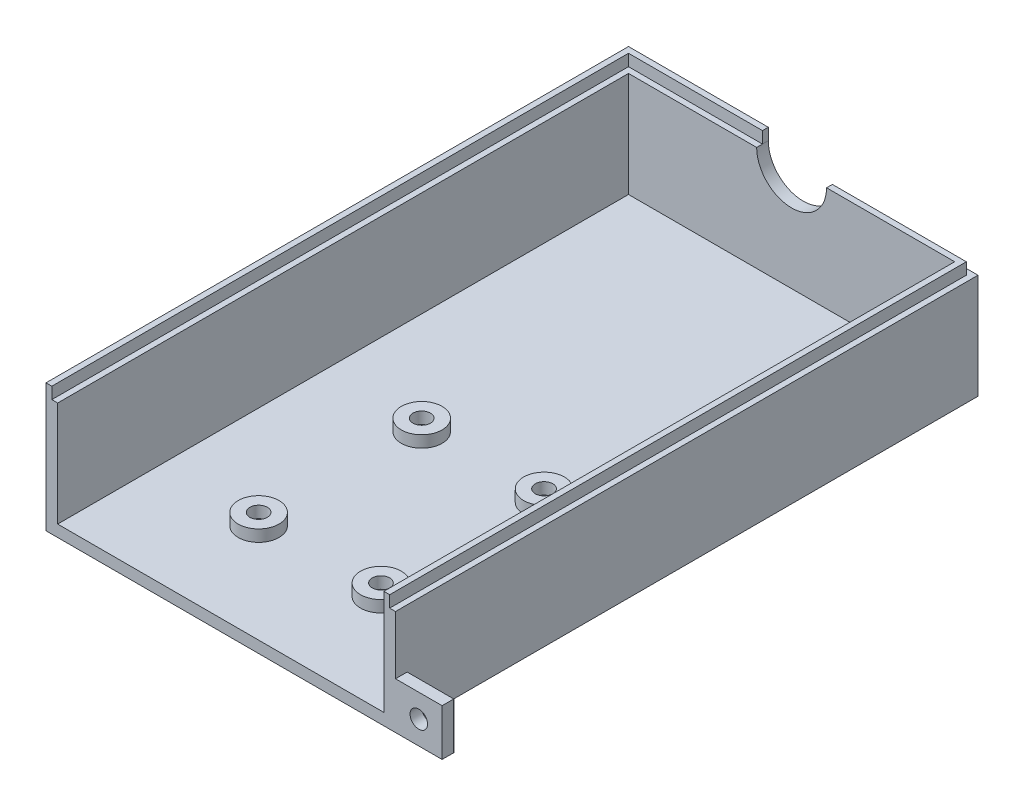
ISO-10303-21;
HEADER;
FILE_DESCRIPTION(('STEP AP214'),'2;1');
FILE_NAME('part.step','',(''),(''),'','','');
FILE_SCHEMA(('AUTOMOTIVE_DESIGN { 1 0 10303 214 1 1 1 1 }'));
ENDSEC;
DATA;
#1=APPLICATION_CONTEXT('core data for automotive mechanical design processes');
#2=APPLICATION_PROTOCOL_DEFINITION('international standard','automotive_design',2000,#1);
#3=PRODUCT_CONTEXT('',#1,'mechanical');
#4=PRODUCT('Part','Part','',(#3));
#5=PRODUCT_RELATED_PRODUCT_CATEGORY('part','',(#4));
#6=PRODUCT_DEFINITION_FORMATION('','',#4);
#7=PRODUCT_DEFINITION_CONTEXT('part definition',#1,'design');
#8=PRODUCT_DEFINITION('design','',#6,#7);
#9=PRODUCT_DEFINITION_SHAPE('','',#8);
#10=(LENGTH_UNIT() NAMED_UNIT(*) SI_UNIT(.MILLI.,.METRE.));
#11=(NAMED_UNIT(*) PLANE_ANGLE_UNIT() SI_UNIT($,.RADIAN.));
#12=(NAMED_UNIT(*) SI_UNIT($,.STERADIAN.) SOLID_ANGLE_UNIT());
#13=UNCERTAINTY_MEASURE_WITH_UNIT(LENGTH_MEASURE(1.E-05),#10,'distance_accuracy_value','');
#14=(GEOMETRIC_REPRESENTATION_CONTEXT(3) GLOBAL_UNCERTAINTY_ASSIGNED_CONTEXT((#13)) GLOBAL_UNIT_ASSIGNED_CONTEXT((#10,
#11,#12)) REPRESENTATION_CONTEXT('',''));
#15=CARTESIAN_POINT('',(0.,0.,0.));
#16=DIRECTION('',(0.,0.,1.));
#17=DIRECTION('',(1.,0.,0.));
#18=AXIS2_PLACEMENT_3D('',#15,#16,#17);
#19=CARTESIAN_POINT('',(60.,40.,0.));
#20=DIRECTION('',(-1.,0.,0.));
#21=DIRECTION('',(0.,0.,1.));
#22=AXIS2_PLACEMENT_3D('',#19,#20,#21);
#23=PLANE('',#22);
#24=DIRECTION('',(0.,0.,1.));
#25=VECTOR('',#24,1.);
#26=CARTESIAN_POINT('',(60.,8.,-2.));
#27=LINE('',#26,#25);
#28=CARTESIAN_POINT('',(60.,8.,-2.));
#29=VERTEX_POINT('',#28);
#30=CARTESIAN_POINT('',(60.,8.,0.));
#31=VERTEX_POINT('',#30);
#32=EDGE_CURVE('E203',#29,#31,#27,.T.);
#33=ORIENTED_EDGE('',*,*,#32,.F.);
#34=DIRECTION('',(0.,-1.,0.));
#35=VECTOR('',#34,1.);
#36=CARTESIAN_POINT('',(60.,0.,-2.));
#37=LINE('',#36,#35);
#38=CARTESIAN_POINT('',(60.,0.,-2.));
#39=VERTEX_POINT('',#38);
#40=EDGE_CURVE('E192',#29,#39,#37,.T.);
#41=ORIENTED_EDGE('',*,*,#40,.T.);
#42=DIRECTION('',(0.,0.,-1.));
#43=VECTOR('',#42,1.);
#44=CARTESIAN_POINT('',(60.,0.,0.));
#45=LINE('',#44,#43);
#46=CARTESIAN_POINT('',(60.,0.,-100.));
#47=VERTEX_POINT('',#46);
#48=EDGE_CURVE('E191',#39,#47,#45,.T.);
#49=ORIENTED_EDGE('',*,*,#48,.T.);
#50=DIRECTION('',(0.,-1.,0.));
#51=VECTOR('',#50,1.);
#52=CARTESIAN_POINT('',(60.,40.,-100.));
#53=LINE('',#52,#51);
#54=CARTESIAN_POINT('',(60.,18.,-100.));
#55=VERTEX_POINT('',#54);
#56=EDGE_CURVE('E349',#55,#47,#53,.T.);
#57=ORIENTED_EDGE('',*,*,#56,.F.);
#58=DIRECTION('',(0.,0.,-1.));
#59=VECTOR('',#58,1.);
#60=CARTESIAN_POINT('',(60.,18.,0.));
#61=LINE('',#60,#59);
#62=CARTESIAN_POINT('',(60.,18.,0.));
#63=VERTEX_POINT('',#62);
#64=EDGE_CURVE('E245',#63,#55,#61,.T.);
#65=ORIENTED_EDGE('',*,*,#64,.F.);
#66=DIRECTION('',(0.,-1.,0.));
#67=VECTOR('',#66,1.);
#68=CARTESIAN_POINT('',(60.,40.,0.));
#69=LINE('',#68,#67);
#70=EDGE_CURVE('E352',#63,#31,#69,.T.);
#71=ORIENTED_EDGE('',*,*,#70,.T.);
#72=EDGE_LOOP('',(#33,#41,#49,#57,#65,#71));
#73=FACE_BOUND('',#72,.T.);
#74=ADVANCED_FACE('F37',(#73),#23,.F.);
#75=CARTESIAN_POINT('',(0.,40.,-100.));
#76=DIRECTION('',(0.,0.,1.));
#77=DIRECTION('',(1.,0.,0.));
#78=AXIS2_PLACEMENT_3D('',#75,#76,#77);
#79=PLANE('',#78);
#80=DIRECTION('',(-1.,0.,0.));
#81=VECTOR('',#80,1.);
#82=CARTESIAN_POINT('',(0.,18.,-100.));
#83=LINE('',#82,#81);
#84=CARTESIAN_POINT('',(35.6568542494924,18.,-100.));
#85=VERTEX_POINT('',#84);
#86=EDGE_CURVE('E247',#55,#85,#83,.T.);
#87=ORIENTED_EDGE('',*,*,#86,.F.);
#88=ORIENTED_EDGE('',*,*,#56,.T.);
#89=DIRECTION('',(-1.,0.,0.));
#90=VECTOR('',#89,1.);
#91=CARTESIAN_POINT('',(0.,0.,-100.));
#92=LINE('',#91,#90);
#93=CARTESIAN_POINT('',(0.,0.,-100.));
#94=VERTEX_POINT('',#93);
#95=EDGE_CURVE('E344',#47,#94,#92,.T.);
#96=ORIENTED_EDGE('',*,*,#95,.T.);
#97=DIRECTION('',(0.,-1.,0.));
#98=VECTOR('',#97,1.);
#99=CARTESIAN_POINT('',(0.,40.,-100.));
#100=LINE('',#99,#98);
#101=CARTESIAN_POINT('',(0.,22.,-100.));
#102=VERTEX_POINT('',#101);
#103=EDGE_CURVE('E347',#102,#94,#100,.T.);
#104=ORIENTED_EDGE('',*,*,#103,.F.);
#105=DIRECTION('',(1.,0.,0.));
#106=VECTOR('',#105,1.);
#107=CARTESIAN_POINT('',(0.,22.,-100.));
#108=LINE('',#107,#106);
#109=CARTESIAN_POINT('',(24.,22.,-100.));
#110=VERTEX_POINT('',#109);
#111=EDGE_CURVE('E210',#102,#110,#108,.T.);
#112=ORIENTED_EDGE('',*,*,#111,.T.);
#113=DIRECTION('',(0.,-1.,0.));
#114=VECTOR('',#113,1.);
#115=CARTESIAN_POINT('',(24.,22.,-100.));
#116=LINE('',#115,#114);
#117=CARTESIAN_POINT('',(24.,20.,-100.));
#118=VERTEX_POINT('',#117);
#119=EDGE_CURVE('E234',#110,#118,#116,.T.);
#120=ORIENTED_EDGE('',*,*,#119,.T.);
#121=CARTESIAN_POINT('',(30.,20.,-100.));
#122=DIRECTION('',(0.,0.,1.));
#123=DIRECTION('',(1.,0.,0.));
#124=AXIS2_PLACEMENT_3D('',#121,#122,#123);
#125=CIRCLE('',#124,6.);
#126=EDGE_CURVE('E266',#85,#118,#125,.F.);
#127=ORIENTED_EDGE('',*,*,#126,.F.);
#128=EDGE_LOOP('',(#87,#88,#96,#104,#112,#120,#127));
#129=FACE_BOUND('',#128,.T.);
#130=ADVANCED_FACE('F416',(#129),#79,.F.);
#131=CARTESIAN_POINT('',(0.,20.,0.));
#132=DIRECTION('',(0.,-1.,0.));
#133=DIRECTION('',(0.,0.,-1.));
#134=AXIS2_PLACEMENT_3D('',#131,#132,#133);
#135=PLANE('',#134);
#136=DIRECTION('',(0.,0.,1.));
#137=VECTOR('',#136,1.);
#138=CARTESIAN_POINT('',(59.,20.,0.));
#139=LINE('',#138,#137);
#140=CARTESIAN_POINT('',(59.,20.,-99.));
#141=VERTEX_POINT('',#140);
#142=CARTESIAN_POINT('',(59.,20.,0.));
#143=VERTEX_POINT('',#142);
#144=EDGE_CURVE('E240',#141,#143,#139,.T.);
#145=ORIENTED_EDGE('',*,*,#144,.F.);
#146=DIRECTION('',(1.,0.,0.));
#147=VECTOR('',#146,1.);
#148=CARTESIAN_POINT('',(0.,20.,-99.));
#149=LINE('',#148,#147);
#150=CARTESIAN_POINT('',(36.,20.,-99.));
#151=VERTEX_POINT('',#150);
#152=EDGE_CURVE('E236',#151,#141,#149,.T.);
#153=ORIENTED_EDGE('',*,*,#152,.F.);
#154=DIRECTION('',(0.,0.,1.));
#155=VECTOR('',#154,1.);
#156=CARTESIAN_POINT('',(36.,20.,-100.001));
#157=LINE('',#156,#155);
#158=CARTESIAN_POINT('',(36.,20.,-98.));
#159=VERTEX_POINT('',#158);
#160=EDGE_CURVE('E261',#159,#151,#157,.F.);
#161=ORIENTED_EDGE('',*,*,#160,.F.);
#162=DIRECTION('',(-1.,0.,0.));
#163=VECTOR('',#162,1.);
#164=CARTESIAN_POINT('',(0.,20.,-98.));
#165=LINE('',#164,#163);
#166=CARTESIAN_POINT('',(58.,20.,-98.));
#167=VERTEX_POINT('',#166);
#168=EDGE_CURVE('E273',#167,#159,#165,.T.);
#169=ORIENTED_EDGE('',*,*,#168,.F.);
#170=DIRECTION('',(0.,0.,-1.));
#171=VECTOR('',#170,1.);
#172=CARTESIAN_POINT('',(58.,20.,0.));
#173=LINE('',#172,#171);
#174=CARTESIAN_POINT('',(58.,20.,0.));
#175=VERTEX_POINT('',#174);
#176=EDGE_CURVE('E276',#175,#167,#173,.T.);
#177=ORIENTED_EDGE('',*,*,#176,.F.);
#178=DIRECTION('',(1.,0.,0.));
#179=VECTOR('',#178,1.);
#180=CARTESIAN_POINT('',(0.,20.,0.));
#181=LINE('',#180,#179);
#182=EDGE_CURVE('E269',#175,#143,#181,.T.);
#183=ORIENTED_EDGE('',*,*,#182,.T.);
#184=EDGE_LOOP('',(#145,#153,#161,#169,#177,#183));
#185=FACE_BOUND('',#184,.T.);
#186=ADVANCED_FACE('F385',(#185),#135,.F.);
#187=CARTESIAN_POINT('',(0.,40.,0.));
#188=DIRECTION('',(0.,0.,-1.));
#189=DIRECTION('',(-1.,0.,0.));
#190=AXIS2_PLACEMENT_3D('',#187,#188,#189);
#191=PLANE('',#190);
#192=DIRECTION('',(1.,0.,0.));
#193=VECTOR('',#192,1.);
#194=CARTESIAN_POINT('',(0.,18.,0.));
#195=LINE('',#194,#193);
#196=CARTESIAN_POINT('',(59.,18.,0.));
#197=VERTEX_POINT('',#196);
#198=EDGE_CURVE('E243',#197,#63,#195,.T.);
#199=ORIENTED_EDGE('',*,*,#198,.F.);
#200=DIRECTION('',(0.,1.,0.));
#201=VECTOR('',#200,1.);
#202=CARTESIAN_POINT('',(59.,18.,0.));
#203=LINE('',#202,#201);
#204=EDGE_CURVE('E252',#197,#143,#203,.T.);
#205=ORIENTED_EDGE('',*,*,#204,.T.);
#206=ORIENTED_EDGE('',*,*,#182,.F.);
#207=DIRECTION('',(0.,-1.,0.));
#208=VECTOR('',#207,1.);
#209=CARTESIAN_POINT('',(58.,40.,0.));
#210=LINE('',#209,#208);
#211=CARTESIAN_POINT('',(58.,2.,0.));
#212=VERTEX_POINT('',#211);
#213=EDGE_CURVE('E330',#175,#212,#210,.T.);
#214=ORIENTED_EDGE('',*,*,#213,.T.);
#215=DIRECTION('',(1.,0.,0.));
#216=VECTOR('',#215,1.);
#217=CARTESIAN_POINT('',(0.,2.,0.));
#218=LINE('',#217,#216);
#219=CARTESIAN_POINT('',(2.,2.,0.));
#220=VERTEX_POINT('',#219);
#221=EDGE_CURVE('E321',#220,#212,#218,.T.);
#222=ORIENTED_EDGE('',*,*,#221,.F.);
#223=DIRECTION('',(0.,-1.,0.));
#224=VECTOR('',#223,1.);
#225=CARTESIAN_POINT('',(2.,40.,0.));
#226=LINE('',#225,#224);
#227=CARTESIAN_POINT('',(2.,20.,0.));
#228=VERTEX_POINT('',#227);
#229=EDGE_CURVE('E333',#228,#220,#226,.T.);
#230=ORIENTED_EDGE('',*,*,#229,.F.);
#231=CARTESIAN_POINT('',(0.999999999999987,20.,0.));
#232=VERTEX_POINT('',#231);
#233=EDGE_CURVE('E270',#232,#228,#181,.T.);
#234=ORIENTED_EDGE('',*,*,#233,.F.);
#235=DIRECTION('',(0.,-1.,0.));
#236=VECTOR('',#235,1.);
#237=CARTESIAN_POINT('',(0.999999999999987,22.,0.));
#238=LINE('',#237,#236);
#239=CARTESIAN_POINT('',(0.999999999999987,22.,0.));
#240=VERTEX_POINT('',#239);
#241=EDGE_CURVE('E232',#240,#232,#238,.T.);
#242=ORIENTED_EDGE('',*,*,#241,.F.);
#243=DIRECTION('',(-1.,0.,0.));
#244=VECTOR('',#243,1.);
#245=CARTESIAN_POINT('',(0.,22.,0.));
#246=LINE('',#245,#244);
#247=CARTESIAN_POINT('',(0.,22.,0.));
#248=VERTEX_POINT('',#247);
#249=EDGE_CURVE('E216',#240,#248,#246,.T.);
#250=ORIENTED_EDGE('',*,*,#249,.T.);
#251=DIRECTION('',(0.,-1.,0.));
#252=VECTOR('',#251,1.);
#253=CARTESIAN_POINT('',(0.,40.,0.));
#254=LINE('',#253,#252);
#255=CARTESIAN_POINT('',(0.,0.,0.));
#256=VERTEX_POINT('',#255);
#257=EDGE_CURVE('E355',#248,#256,#254,.T.);
#258=ORIENTED_EDGE('',*,*,#257,.T.);
#259=DIRECTION('',(1.,0.,0.));
#260=VECTOR('',#259,1.);
#261=CARTESIAN_POINT('',(0.,0.,0.));
#262=LINE('',#261,#260);
#263=CARTESIAN_POINT('',(68.,0.,0.));
#264=VERTEX_POINT('',#263);
#265=EDGE_CURVE('E341',#256,#264,#262,.T.);
#266=ORIENTED_EDGE('',*,*,#265,.T.);
#267=DIRECTION('',(0.,1.,0.));
#268=VECTOR('',#267,1.);
#269=CARTESIAN_POINT('',(68.,0.,0.));
#270=LINE('',#269,#268);
#271=CARTESIAN_POINT('',(68.,8.,0.));
#272=VERTEX_POINT('',#271);
#273=EDGE_CURVE('E178',#264,#272,#270,.T.);
#274=ORIENTED_EDGE('',*,*,#273,.T.);
#275=DIRECTION('',(-1.,0.,0.));
#276=VECTOR('',#275,1.);
#277=CARTESIAN_POINT('',(60.,8.,0.));
#278=LINE('',#277,#276);
#279=EDGE_CURVE('E194',#272,#31,#278,.T.);
#280=ORIENTED_EDGE('',*,*,#279,.T.);
#281=ORIENTED_EDGE('',*,*,#70,.F.);
#282=EDGE_LOOP('',(#199,#205,#206,#214,#222,#230,#234,#242,#250,#258,#266,#274,#280,#281));
#283=FACE_BOUND('',#282,.T.);
#284=CARTESIAN_POINT('',(64.,4.,0.));
#285=DIRECTION('',(0.,0.,1.));
#286=DIRECTION('',(1.,0.,0.));
#287=AXIS2_PLACEMENT_3D('',#284,#285,#286);
#288=CIRCLE('',#287,1.5);
#289=CARTESIAN_POINT('',(65.5,4.,0.));
#290=VERTEX_POINT('',#289);
#291=EDGE_CURVE('E792',#290,#290,#288,.T.);
#292=ORIENTED_EDGE('',*,*,#291,.F.);
#293=EDGE_LOOP('',(#292));
#294=FACE_BOUND('',#293,.T.);
#295=ADVANCED_FACE('F402',(#283,#294),#191,.F.);
#296=CARTESIAN_POINT('',(0.,40.,0.));
#297=DIRECTION('',(1.,0.,0.));
#298=DIRECTION('',(0.,0.,-1.));
#299=AXIS2_PLACEMENT_3D('',#296,#297,#298);
#300=PLANE('',#299);
#301=ORIENTED_EDGE('',*,*,#257,.F.);
#302=DIRECTION('',(0.,0.,-1.));
#303=VECTOR('',#302,1.);
#304=CARTESIAN_POINT('',(0.,22.,0.));
#305=LINE('',#304,#303);
#306=EDGE_CURVE('E213',#248,#102,#305,.T.);
#307=ORIENTED_EDGE('',*,*,#306,.T.);
#308=ORIENTED_EDGE('',*,*,#103,.T.);
#309=DIRECTION('',(0.,0.,1.));
#310=VECTOR('',#309,1.);
#311=CARTESIAN_POINT('',(0.,0.,0.));
#312=LINE('',#311,#310);
#313=EDGE_CURVE('E335',#94,#256,#312,.T.);
#314=ORIENTED_EDGE('',*,*,#313,.T.);
#315=EDGE_LOOP('',(#301,#307,#308,#314));
#316=FACE_BOUND('',#315,.T.);
#317=ADVANCED_FACE('F39',(#316),#300,.F.);
#318=CARTESIAN_POINT('',(0.,0.,0.));
#319=DIRECTION('',(0.,-1.,0.));
#320=DIRECTION('',(0.,0.,-1.));
#321=AXIS2_PLACEMENT_3D('',#318,#319,#320);
#322=PLANE('',#321);
#323=ORIENTED_EDGE('',*,*,#313,.F.);
#324=ORIENTED_EDGE('',*,*,#95,.F.);
#325=ORIENTED_EDGE('',*,*,#48,.F.);
#326=DIRECTION('',(1.,0.,0.));
#327=VECTOR('',#326,1.);
#328=CARTESIAN_POINT('',(60.,0.,-2.));
#329=LINE('',#328,#327);
#330=CARTESIAN_POINT('',(68.,0.,-2.));
#331=VERTEX_POINT('',#330);
#332=EDGE_CURVE('E52',#39,#331,#329,.T.);
#333=ORIENTED_EDGE('',*,*,#332,.T.);
#334=DIRECTION('',(0.,0.,1.));
#335=VECTOR('',#334,1.);
#336=CARTESIAN_POINT('',(68.,0.,-2.));
#337=LINE('',#336,#335);
#338=EDGE_CURVE('E173',#331,#264,#337,.T.);
#339=ORIENTED_EDGE('',*,*,#338,.T.);
#340=ORIENTED_EDGE('',*,*,#265,.F.);
#341=EDGE_LOOP('',(#323,#324,#325,#333,#339,#340));
#342=FACE_BOUND('',#341,.T.);
#343=ADVANCED_FACE('F189',(#342),#322,.T.);
#344=CARTESIAN_POINT('',(2.,40.,0.));
#345=DIRECTION('',(1.,0.,0.));
#346=DIRECTION('',(0.,0.,-1.));
#347=AXIS2_PLACEMENT_3D('',#344,#345,#346);
#348=PLANE('',#347);
#349=DIRECTION('',(0.,0.,1.));
#350=VECTOR('',#349,1.);
#351=CARTESIAN_POINT('',(2.,20.,0.));
#352=LINE('',#351,#350);
#353=CARTESIAN_POINT('',(2.,20.,-98.));
#354=VERTEX_POINT('',#353);
#355=EDGE_CURVE('E279',#354,#228,#352,.T.);
#356=ORIENTED_EDGE('',*,*,#355,.T.);
#357=ORIENTED_EDGE('',*,*,#229,.T.);
#358=DIRECTION('',(0.,0.,1.));
#359=VECTOR('',#358,1.);
#360=CARTESIAN_POINT('',(2.,2.,0.));
#361=LINE('',#360,#359);
#362=CARTESIAN_POINT('',(2.,2.,-98.));
#363=VERTEX_POINT('',#362);
#364=EDGE_CURVE('E316',#363,#220,#361,.T.);
#365=ORIENTED_EDGE('',*,*,#364,.F.);
#366=DIRECTION('',(0.,-1.,0.));
#367=VECTOR('',#366,1.);
#368=CARTESIAN_POINT('',(2.,40.,-98.));
#369=LINE('',#368,#367);
#370=EDGE_CURVE('E322',#354,#363,#369,.T.);
#371=ORIENTED_EDGE('',*,*,#370,.F.);
#372=EDGE_LOOP('',(#356,#357,#365,#371));
#373=FACE_BOUND('',#372,.T.);
#374=ADVANCED_FACE('F428',(#373),#348,.T.);
#375=CARTESIAN_POINT('',(58.,40.,0.));
#376=DIRECTION('',(-1.,0.,0.));
#377=DIRECTION('',(0.,0.,1.));
#378=AXIS2_PLACEMENT_3D('',#375,#376,#377);
#379=PLANE('',#378);
#380=ORIENTED_EDGE('',*,*,#176,.T.);
#381=DIRECTION('',(0.,-1.,0.));
#382=VECTOR('',#381,1.);
#383=CARTESIAN_POINT('',(58.,40.,-98.));
#384=LINE('',#383,#382);
#385=CARTESIAN_POINT('',(58.,2.,-98.));
#386=VERTEX_POINT('',#385);
#387=EDGE_CURVE('E324',#167,#386,#384,.T.);
#388=ORIENTED_EDGE('',*,*,#387,.T.);
#389=DIRECTION('',(0.,0.,-1.));
#390=VECTOR('',#389,1.);
#391=CARTESIAN_POINT('',(58.,2.,0.));
#392=LINE('',#391,#390);
#393=EDGE_CURVE('E328',#212,#386,#392,.T.);
#394=ORIENTED_EDGE('',*,*,#393,.F.);
#395=ORIENTED_EDGE('',*,*,#213,.F.);
#396=EDGE_LOOP('',(#380,#388,#394,#395));
#397=FACE_BOUND('',#396,.T.);
#398=ADVANCED_FACE('F393',(#397),#379,.T.);
#399=CARTESIAN_POINT('',(0.,40.,-98.));
#400=DIRECTION('',(0.,0.,1.));
#401=DIRECTION('',(1.,0.,0.));
#402=AXIS2_PLACEMENT_3D('',#399,#400,#401);
#403=PLANE('',#402);
#404=CARTESIAN_POINT('',(30.,20.,-98.));
#405=DIRECTION('',(0.,0.,1.));
#406=DIRECTION('',(1.,0.,0.));
#407=AXIS2_PLACEMENT_3D('',#404,#405,#406);
#408=CIRCLE('',#407,6.);
#409=CARTESIAN_POINT('',(24.,20.,-98.));
#410=VERTEX_POINT('',#409);
#411=EDGE_CURVE('E264',#410,#159,#408,.T.);
#412=ORIENTED_EDGE('',*,*,#411,.F.);
#413=EDGE_CURVE('E272',#410,#354,#165,.T.);
#414=ORIENTED_EDGE('',*,*,#413,.T.);
#415=ORIENTED_EDGE('',*,*,#370,.T.);
#416=DIRECTION('',(-1.,0.,0.));
#417=VECTOR('',#416,1.);
#418=CARTESIAN_POINT('',(0.,2.,-98.));
#419=LINE('',#418,#417);
#420=EDGE_CURVE('E325',#386,#363,#419,.T.);
#421=ORIENTED_EDGE('',*,*,#420,.F.);
#422=ORIENTED_EDGE('',*,*,#387,.F.);
#423=ORIENTED_EDGE('',*,*,#168,.T.);
#424=EDGE_LOOP('',(#412,#414,#415,#421,#422,#423));
#425=FACE_BOUND('',#424,.T.);
#426=ADVANCED_FACE('F388',(#425),#403,.T.);
#427=CARTESIAN_POINT('',(0.,2.,0.));
#428=DIRECTION('',(0.,-1.,0.));
#429=DIRECTION('',(0.,0.,-1.));
#430=AXIS2_PLACEMENT_3D('',#427,#428,#429);
#431=PLANE('',#430);
#432=CARTESIAN_POINT('',(19.5,2.,-45.));
#433=DIRECTION('',(0.,-1.,0.));
#434=DIRECTION('',(0.,0.,-1.));
#435=AXIS2_PLACEMENT_3D('',#432,#433,#434);
#436=CIRCLE('',#435,3.5);
#437=CARTESIAN_POINT('',(19.5,2.,-48.5));
#438=VERTEX_POINT('',#437);
#439=EDGE_CURVE('E366',#438,#438,#436,.F.);
#440=ORIENTED_EDGE('',*,*,#439,.F.);
#441=EDGE_LOOP('',(#440));
#442=FACE_BOUND('',#441,.T.);
#443=CARTESIAN_POINT('',(40.5,2.,-45.));
#444=DIRECTION('',(0.,-1.,0.));
#445=DIRECTION('',(0.,0.,-1.));
#446=AXIS2_PLACEMENT_3D('',#443,#444,#445);
#447=CIRCLE('',#446,3.5);
#448=CARTESIAN_POINT('',(40.5,2.,-48.5));
#449=VERTEX_POINT('',#448);
#450=EDGE_CURVE('E363',#449,#449,#447,.F.);
#451=ORIENTED_EDGE('',*,*,#450,.F.);
#452=EDGE_LOOP('',(#451));
#453=FACE_BOUND('',#452,.T.);
#454=CARTESIAN_POINT('',(40.5,2.,-17.));
#455=DIRECTION('',(0.,-1.,0.));
#456=DIRECTION('',(0.,0.,-1.));
#457=AXIS2_PLACEMENT_3D('',#454,#455,#456);
#458=CIRCLE('',#457,3.5);
#459=CARTESIAN_POINT('',(40.5,2.,-20.5));
#460=VERTEX_POINT('',#459);
#461=EDGE_CURVE('E360',#460,#460,#458,.F.);
#462=ORIENTED_EDGE('',*,*,#461,.F.);
#463=EDGE_LOOP('',(#462));
#464=FACE_BOUND('',#463,.T.);
#465=CARTESIAN_POINT('',(19.5,2.,-17.));
#466=DIRECTION('',(0.,-1.,0.));
#467=DIRECTION('',(0.,0.,-1.));
#468=AXIS2_PLACEMENT_3D('',#465,#466,#467);
#469=CIRCLE('',#468,3.5);
#470=CARTESIAN_POINT('',(19.5,2.,-20.5));
#471=VERTEX_POINT('',#470);
#472=EDGE_CURVE('E357',#471,#471,#469,.F.);
#473=ORIENTED_EDGE('',*,*,#472,.F.);
#474=EDGE_LOOP('',(#473));
#475=FACE_BOUND('',#474,.T.);
#476=ORIENTED_EDGE('',*,*,#364,.T.);
#477=ORIENTED_EDGE('',*,*,#221,.T.);
#478=ORIENTED_EDGE('',*,*,#393,.T.);
#479=ORIENTED_EDGE('',*,*,#420,.T.);
#480=EDGE_LOOP('',(#476,#477,#478,#479));
#481=FACE_BOUND('',#480,.T.);
#482=ADVANCED_FACE('F396',(#442,#453,#464,#475,#481),#431,.F.);
#483=CARTESIAN_POINT('',(19.5,4.,-17.));
#484=DIRECTION('',(0.,-1.,0.));
#485=DIRECTION('',(0.,0.,-1.));
#486=AXIS2_PLACEMENT_3D('',#483,#484,#485);
#487=CYLINDRICAL_SURFACE('',#486,1.5);
#488=CARTESIAN_POINT('',(19.5,4.,-17.));
#489=DIRECTION('',(0.,1.,0.));
#490=DIRECTION('',(0.,0.,1.));
#491=AXIS2_PLACEMENT_3D('',#488,#489,#490);
#492=CIRCLE('',#491,1.5);
#493=CARTESIAN_POINT('',(19.5,4.,-15.5));
#494=VERTEX_POINT('',#493);
#495=EDGE_CURVE('E310',#494,#494,#492,.T.);
#496=ORIENTED_EDGE('',*,*,#495,.T.);
#497=EDGE_LOOP('',(#496));
#498=FACE_BOUND('',#497,.T.);
#499=CARTESIAN_POINT('',(19.5,2.,-17.));
#500=DIRECTION('',(0.,1.,0.));
#501=DIRECTION('',(0.,0.,1.));
#502=AXIS2_PLACEMENT_3D('',#499,#500,#501);
#503=CIRCLE('',#502,1.5);
#504=CARTESIAN_POINT('',(19.5,2.,-15.5));
#505=VERTEX_POINT('',#504);
#506=EDGE_CURVE('E307',#505,#505,#503,.T.);
#507=ORIENTED_EDGE('',*,*,#506,.F.);
#508=EDGE_LOOP('',(#507));
#509=FACE_BOUND('',#508,.T.);
#510=ADVANCED_FACE('F477',(#498,#509),#487,.F.);
#511=CARTESIAN_POINT('',(19.5,4.,-17.));
#512=DIRECTION('',(0.,-1.,0.));
#513=DIRECTION('',(0.,0.,-1.));
#514=AXIS2_PLACEMENT_3D('',#511,#512,#513);
#515=CYLINDRICAL_SURFACE('',#514,3.5);
#516=CARTESIAN_POINT('',(19.5,4.,-17.));
#517=DIRECTION('',(0.,1.,0.));
#518=DIRECTION('',(0.,0.,1.));
#519=AXIS2_PLACEMENT_3D('',#516,#517,#518);
#520=CIRCLE('',#519,3.5);
#521=CARTESIAN_POINT('',(19.5,4.,-13.5));
#522=VERTEX_POINT('',#521);
#523=EDGE_CURVE('E313',#522,#522,#520,.T.);
#524=ORIENTED_EDGE('',*,*,#523,.F.);
#525=EDGE_LOOP('',(#524));
#526=FACE_BOUND('',#525,.T.);
#527=ORIENTED_EDGE('',*,*,#472,.T.);
#528=EDGE_LOOP('',(#527));
#529=FACE_BOUND('',#528,.T.);
#530=ADVANCED_FACE('F484',(#526,#529),#515,.T.);
#531=CARTESIAN_POINT('',(0.,4.,0.));
#532=DIRECTION('',(0.,1.,0.));
#533=DIRECTION('',(0.,0.,1.));
#534=AXIS2_PLACEMENT_3D('',#531,#532,#533);
#535=PLANE('',#534);
#536=ORIENTED_EDGE('',*,*,#495,.F.);
#537=EDGE_LOOP('',(#536));
#538=FACE_BOUND('',#537,.T.);
#539=ORIENTED_EDGE('',*,*,#523,.T.);
#540=EDGE_LOOP('',(#539));
#541=FACE_BOUND('',#540,.T.);
#542=ADVANCED_FACE('F490',(#538,#541),#535,.T.);
#543=ORIENTED_EDGE('',*,*,#506,.T.);
#544=EDGE_LOOP('',(#543));
#545=FACE_BOUND('',#544,.T.);
#546=ADVANCED_FACE('F479',(#545),#431,.F.);
#547=CARTESIAN_POINT('',(40.5,4.,-17.));
#548=DIRECTION('',(0.,-1.,0.));
#549=DIRECTION('',(0.,0.,-1.));
#550=AXIS2_PLACEMENT_3D('',#547,#548,#549);
#551=CYLINDRICAL_SURFACE('',#550,1.5);
#552=CARTESIAN_POINT('',(40.5,4.,-17.));
#553=DIRECTION('',(0.,1.,0.));
#554=DIRECTION('',(0.,0.,1.));
#555=AXIS2_PLACEMENT_3D('',#552,#553,#554);
#556=CIRCLE('',#555,1.5);
#557=CARTESIAN_POINT('',(40.5,4.,-15.5));
#558=VERTEX_POINT('',#557);
#559=EDGE_CURVE('E301',#558,#558,#556,.T.);
#560=ORIENTED_EDGE('',*,*,#559,.T.);
#561=EDGE_LOOP('',(#560));
#562=FACE_BOUND('',#561,.T.);
#563=CARTESIAN_POINT('',(40.5,2.,-17.));
#564=DIRECTION('',(0.,1.,0.));
#565=DIRECTION('',(0.,0.,1.));
#566=AXIS2_PLACEMENT_3D('',#563,#564,#565);
#567=CIRCLE('',#566,1.5);
#568=CARTESIAN_POINT('',(40.5,2.,-15.5));
#569=VERTEX_POINT('',#568);
#570=EDGE_CURVE('E298',#569,#569,#567,.T.);
#571=ORIENTED_EDGE('',*,*,#570,.F.);
#572=EDGE_LOOP('',(#571));
#573=FACE_BOUND('',#572,.T.);
#574=ADVANCED_FACE('F489',(#562,#573),#551,.F.);
#575=CARTESIAN_POINT('',(40.5,4.,-17.));
#576=DIRECTION('',(0.,-1.,0.));
#577=DIRECTION('',(0.,0.,-1.));
#578=AXIS2_PLACEMENT_3D('',#575,#576,#577);
#579=CYLINDRICAL_SURFACE('',#578,3.5);
#580=CARTESIAN_POINT('',(40.5,4.,-17.));
#581=DIRECTION('',(0.,1.,0.));
#582=DIRECTION('',(0.,0.,1.));
#583=AXIS2_PLACEMENT_3D('',#580,#581,#582);
#584=CIRCLE('',#583,3.5);
#585=CARTESIAN_POINT('',(40.5,4.,-13.5));
#586=VERTEX_POINT('',#585);
#587=EDGE_CURVE('E304',#586,#586,#584,.T.);
#588=ORIENTED_EDGE('',*,*,#587,.F.);
#589=EDGE_LOOP('',(#588));
#590=FACE_BOUND('',#589,.T.);
#591=ORIENTED_EDGE('',*,*,#461,.T.);
#592=EDGE_LOOP('',(#591));
#593=FACE_BOUND('',#592,.T.);
#594=ADVANCED_FACE('F496',(#590,#593),#579,.T.);
#595=CARTESIAN_POINT('',(0.,4.,0.));
#596=DIRECTION('',(0.,1.,0.));
#597=DIRECTION('',(0.,0.,1.));
#598=AXIS2_PLACEMENT_3D('',#595,#596,#597);
#599=PLANE('',#598);
#600=ORIENTED_EDGE('',*,*,#559,.F.);
#601=EDGE_LOOP('',(#600));
#602=FACE_BOUND('',#601,.T.);
#603=ORIENTED_EDGE('',*,*,#587,.T.);
#604=EDGE_LOOP('',(#603));
#605=FACE_BOUND('',#604,.T.);
#606=ADVANCED_FACE('F503',(#602,#605),#599,.T.);
#607=ORIENTED_EDGE('',*,*,#570,.T.);
#608=EDGE_LOOP('',(#607));
#609=FACE_BOUND('',#608,.T.);
#610=ADVANCED_FACE('F475',(#609),#431,.F.);
#611=CARTESIAN_POINT('',(40.5,4.,-45.));
#612=DIRECTION('',(0.,-1.,0.));
#613=DIRECTION('',(0.,0.,-1.));
#614=AXIS2_PLACEMENT_3D('',#611,#612,#613);
#615=CYLINDRICAL_SURFACE('',#614,1.5);
#616=CARTESIAN_POINT('',(40.5,4.,-45.));
#617=DIRECTION('',(0.,1.,0.));
#618=DIRECTION('',(0.,0.,1.));
#619=AXIS2_PLACEMENT_3D('',#616,#617,#618);
#620=CIRCLE('',#619,1.5);
#621=CARTESIAN_POINT('',(40.5,4.,-43.5));
#622=VERTEX_POINT('',#621);
#623=EDGE_CURVE('E292',#622,#622,#620,.T.);
#624=ORIENTED_EDGE('',*,*,#623,.T.);
#625=EDGE_LOOP('',(#624));
#626=FACE_BOUND('',#625,.T.);
#627=CARTESIAN_POINT('',(40.5,2.,-45.));
#628=DIRECTION('',(0.,1.,0.));
#629=DIRECTION('',(0.,0.,1.));
#630=AXIS2_PLACEMENT_3D('',#627,#628,#629);
#631=CIRCLE('',#630,1.5);
#632=CARTESIAN_POINT('',(40.5,2.,-43.5));
#633=VERTEX_POINT('',#632);
#634=EDGE_CURVE('E289',#633,#633,#631,.T.);
#635=ORIENTED_EDGE('',*,*,#634,.F.);
#636=EDGE_LOOP('',(#635));
#637=FACE_BOUND('',#636,.T.);
#638=ADVANCED_FACE('F502',(#626,#637),#615,.F.);
#639=CARTESIAN_POINT('',(40.5,4.,-45.));
#640=DIRECTION('',(0.,-1.,0.));
#641=DIRECTION('',(0.,0.,-1.));
#642=AXIS2_PLACEMENT_3D('',#639,#640,#641);
#643=CYLINDRICAL_SURFACE('',#642,3.5);
#644=CARTESIAN_POINT('',(40.5,4.,-45.));
#645=DIRECTION('',(0.,1.,0.));
#646=DIRECTION('',(0.,0.,1.));
#647=AXIS2_PLACEMENT_3D('',#644,#645,#646);
#648=CIRCLE('',#647,3.5);
#649=CARTESIAN_POINT('',(40.5,4.,-41.5));
#650=VERTEX_POINT('',#649);
#651=EDGE_CURVE('E295',#650,#650,#648,.T.);
#652=ORIENTED_EDGE('',*,*,#651,.F.);
#653=EDGE_LOOP('',(#652));
#654=FACE_BOUND('',#653,.T.);
#655=ORIENTED_EDGE('',*,*,#450,.T.);
#656=EDGE_LOOP('',(#655));
#657=FACE_BOUND('',#656,.T.);
#658=ADVANCED_FACE('F509',(#654,#657),#643,.T.);
#659=CARTESIAN_POINT('',(0.,4.,0.));
#660=DIRECTION('',(0.,1.,0.));
#661=DIRECTION('',(0.,0.,1.));
#662=AXIS2_PLACEMENT_3D('',#659,#660,#661);
#663=PLANE('',#662);
#664=ORIENTED_EDGE('',*,*,#623,.F.);
#665=EDGE_LOOP('',(#664));
#666=FACE_BOUND('',#665,.T.);
#667=ORIENTED_EDGE('',*,*,#651,.T.);
#668=EDGE_LOOP('',(#667));
#669=FACE_BOUND('',#668,.T.);
#670=ADVANCED_FACE('F473',(#666,#669),#663,.T.);
#671=ORIENTED_EDGE('',*,*,#634,.T.);
#672=EDGE_LOOP('',(#671));
#673=FACE_BOUND('',#672,.T.);
#674=ADVANCED_FACE('F464',(#673),#431,.F.);
#675=CARTESIAN_POINT('',(19.5,4.,-45.));
#676=DIRECTION('',(0.,-1.,0.));
#677=DIRECTION('',(0.,0.,-1.));
#678=AXIS2_PLACEMENT_3D('',#675,#676,#677);
#679=CYLINDRICAL_SURFACE('',#678,1.5);
#680=CARTESIAN_POINT('',(19.5,4.,-45.));
#681=DIRECTION('',(0.,1.,0.));
#682=DIRECTION('',(0.,0.,1.));
#683=AXIS2_PLACEMENT_3D('',#680,#681,#682);
#684=CIRCLE('',#683,1.5);
#685=CARTESIAN_POINT('',(19.5,4.,-43.5));
#686=VERTEX_POINT('',#685);
#687=EDGE_CURVE('E283',#686,#686,#684,.T.);
#688=ORIENTED_EDGE('',*,*,#687,.T.);
#689=EDGE_LOOP('',(#688));
#690=FACE_BOUND('',#689,.T.);
#691=CARTESIAN_POINT('',(19.5,2.,-45.));
#692=DIRECTION('',(0.,1.,0.));
#693=DIRECTION('',(0.,0.,1.));
#694=AXIS2_PLACEMENT_3D('',#691,#692,#693);
#695=CIRCLE('',#694,1.5);
#696=CARTESIAN_POINT('',(19.5,2.,-43.5));
#697=VERTEX_POINT('',#696);
#698=EDGE_CURVE('E282',#697,#697,#695,.T.);
#699=ORIENTED_EDGE('',*,*,#698,.F.);
#700=EDGE_LOOP('',(#699));
#701=FACE_BOUND('',#700,.T.);
#702=ADVANCED_FACE('F472',(#690,#701),#679,.F.);
#703=CARTESIAN_POINT('',(19.5,4.,-45.));
#704=DIRECTION('',(0.,-1.,0.));
#705=DIRECTION('',(0.,0.,-1.));
#706=AXIS2_PLACEMENT_3D('',#703,#704,#705);
#707=CYLINDRICAL_SURFACE('',#706,3.5);
#708=CARTESIAN_POINT('',(19.5,4.,-45.));
#709=DIRECTION('',(0.,1.,0.));
#710=DIRECTION('',(0.,0.,1.));
#711=AXIS2_PLACEMENT_3D('',#708,#709,#710);
#712=CIRCLE('',#711,3.5);
#713=CARTESIAN_POINT('',(19.5,4.,-41.5));
#714=VERTEX_POINT('',#713);
#715=EDGE_CURVE('E286',#714,#714,#712,.T.);
#716=ORIENTED_EDGE('',*,*,#715,.F.);
#717=EDGE_LOOP('',(#716));
#718=FACE_BOUND('',#717,.T.);
#719=ORIENTED_EDGE('',*,*,#439,.T.);
#720=EDGE_LOOP('',(#719));
#721=FACE_BOUND('',#720,.T.);
#722=ADVANCED_FACE('F468',(#718,#721),#707,.T.);
#723=CARTESIAN_POINT('',(0.,4.,0.));
#724=DIRECTION('',(0.,1.,0.));
#725=DIRECTION('',(0.,0.,1.));
#726=AXIS2_PLACEMENT_3D('',#723,#724,#725);
#727=PLANE('',#726);
#728=ORIENTED_EDGE('',*,*,#687,.F.);
#729=EDGE_LOOP('',(#728));
#730=FACE_BOUND('',#729,.T.);
#731=ORIENTED_EDGE('',*,*,#715,.T.);
#732=EDGE_LOOP('',(#731));
#733=FACE_BOUND('',#732,.T.);
#734=ADVANCED_FACE('F461',(#730,#733),#727,.T.);
#735=ORIENTED_EDGE('',*,*,#698,.T.);
#736=EDGE_LOOP('',(#735));
#737=FACE_BOUND('',#736,.T.);
#738=ADVANCED_FACE('F456',(#737),#431,.F.);
#739=DIRECTION('',(-1.,0.,0.));
#740=VECTOR('',#739,1.);
#741=CARTESIAN_POINT('',(0.,20.,-99.));
#742=LINE('',#741,#740);
#743=CARTESIAN_POINT('',(24.,20.,-99.));
#744=VERTEX_POINT('',#743);
#745=CARTESIAN_POINT('',(1.00000000000001,20.,-99.));
#746=VERTEX_POINT('',#745);
#747=EDGE_CURVE('E60',#744,#746,#742,.T.);
#748=ORIENTED_EDGE('',*,*,#747,.T.);
#749=DIRECTION('',(0.,0.,1.));
#750=VECTOR('',#749,1.);
#751=CARTESIAN_POINT('',(0.999999999999987,20.,0.));
#752=LINE('',#751,#750);
#753=EDGE_CURVE('E205',#746,#232,#752,.T.);
#754=ORIENTED_EDGE('',*,*,#753,.T.);
#755=ORIENTED_EDGE('',*,*,#233,.T.);
#756=ORIENTED_EDGE('',*,*,#355,.F.);
#757=ORIENTED_EDGE('',*,*,#413,.F.);
#758=DIRECTION('',(0.,0.,1.));
#759=VECTOR('',#758,1.);
#760=CARTESIAN_POINT('',(24.,20.,-100.001));
#761=LINE('',#760,#759);
#762=EDGE_CURVE('E255',#744,#410,#761,.T.);
#763=ORIENTED_EDGE('',*,*,#762,.F.);
#764=EDGE_LOOP('',(#748,#754,#755,#756,#757,#763));
#765=FACE_BOUND('',#764,.T.);
#766=ADVANCED_FACE('F424',(#765),#135,.F.);
#767=CARTESIAN_POINT('',(30.,20.,-100.001));
#768=DIRECTION('',(0.,0.,1.));
#769=DIRECTION('',(1.,0.,0.));
#770=AXIS2_PLACEMENT_3D('',#767,#768,#769);
#771=CYLINDRICAL_SURFACE('',#770,6.);
#772=ORIENTED_EDGE('',*,*,#160,.T.);
#773=CARTESIAN_POINT('',(30.,20.,-99.));
#774=DIRECTION('',(0.,0.,1.));
#775=DIRECTION('',(1.,0.,0.));
#776=AXIS2_PLACEMENT_3D('',#773,#774,#775);
#777=CIRCLE('',#776,6.);
#778=CARTESIAN_POINT('',(35.6568542494924,18.,-99.));
#779=VERTEX_POINT('',#778);
#780=EDGE_CURVE('E11',#151,#779,#777,.F.);
#781=ORIENTED_EDGE('',*,*,#780,.T.);
#782=DIRECTION('',(0.,0.,1.));
#783=VECTOR('',#782,1.);
#784=CARTESIAN_POINT('',(35.6568542494924,18.,-100.001));
#785=LINE('',#784,#783);
#786=EDGE_CURVE('E45',#85,#779,#785,.T.);
#787=ORIENTED_EDGE('',*,*,#786,.F.);
#788=ORIENTED_EDGE('',*,*,#126,.T.);
#789=EDGE_CURVE('E258',#118,#744,#761,.T.);
#790=ORIENTED_EDGE('',*,*,#789,.T.);
#791=ORIENTED_EDGE('',*,*,#762,.T.);
#792=ORIENTED_EDGE('',*,*,#411,.T.);
#793=EDGE_LOOP('',(#772,#781,#787,#788,#790,#791,#792));
#794=FACE_BOUND('',#793,.T.);
#795=ADVANCED_FACE('F380',(#794),#771,.F.);
#796=CARTESIAN_POINT('',(0.,18.,-99.));
#797=DIRECTION('',(0.,0.,1.));
#798=DIRECTION('',(1.,0.,0.));
#799=AXIS2_PLACEMENT_3D('',#796,#797,#798);
#800=PLANE('',#799);
#801=ORIENTED_EDGE('',*,*,#152,.T.);
#802=DIRECTION('',(0.,1.,0.));
#803=VECTOR('',#802,1.);
#804=CARTESIAN_POINT('',(59.,18.,-99.));
#805=LINE('',#804,#803);
#806=CARTESIAN_POINT('',(59.,18.,-99.));
#807=VERTEX_POINT('',#806);
#808=EDGE_CURVE('E249',#807,#141,#805,.T.);
#809=ORIENTED_EDGE('',*,*,#808,.F.);
#810=DIRECTION('',(1.,0.,0.));
#811=VECTOR('',#810,1.);
#812=CARTESIAN_POINT('',(0.,18.,-99.));
#813=LINE('',#812,#811);
#814=EDGE_CURVE('E237',#779,#807,#813,.T.);
#815=ORIENTED_EDGE('',*,*,#814,.F.);
#816=ORIENTED_EDGE('',*,*,#780,.F.);
#817=EDGE_LOOP('',(#801,#809,#815,#816));
#818=FACE_BOUND('',#817,.T.);
#819=ADVANCED_FACE('F377',(#818),#800,.F.);
#820=CARTESIAN_POINT('',(0.,18.,0.));
#821=DIRECTION('',(0.,1.,0.));
#822=DIRECTION('',(0.,0.,1.));
#823=AXIS2_PLACEMENT_3D('',#820,#821,#822);
#824=PLANE('',#823);
#825=ORIENTED_EDGE('',*,*,#786,.T.);
#826=ORIENTED_EDGE('',*,*,#814,.T.);
#827=DIRECTION('',(0.,0.,1.));
#828=VECTOR('',#827,1.);
#829=CARTESIAN_POINT('',(59.,18.,0.));
#830=LINE('',#829,#828);
#831=EDGE_CURVE('E239',#807,#197,#830,.T.);
#832=ORIENTED_EDGE('',*,*,#831,.T.);
#833=ORIENTED_EDGE('',*,*,#198,.T.);
#834=ORIENTED_EDGE('',*,*,#64,.T.);
#835=ORIENTED_EDGE('',*,*,#86,.T.);
#836=EDGE_LOOP('',(#825,#826,#832,#833,#834,#835));
#837=FACE_BOUND('',#836,.T.);
#838=ADVANCED_FACE('F371',(#837),#824,.T.);
#839=CARTESIAN_POINT('',(59.,18.,0.));
#840=DIRECTION('',(-1.,0.,0.));
#841=DIRECTION('',(0.,0.,1.));
#842=AXIS2_PLACEMENT_3D('',#839,#840,#841);
#843=PLANE('',#842);
#844=ORIENTED_EDGE('',*,*,#144,.T.);
#845=ORIENTED_EDGE('',*,*,#204,.F.);
#846=ORIENTED_EDGE('',*,*,#831,.F.);
#847=ORIENTED_EDGE('',*,*,#808,.T.);
#848=EDGE_LOOP('',(#844,#845,#846,#847));
#849=FACE_BOUND('',#848,.T.);
#850=ADVANCED_FACE('F408',(#849),#843,.F.);
#851=CARTESIAN_POINT('',(24.,22.,0.));
#852=DIRECTION('',(1.,0.,0.));
#853=DIRECTION('',(0.,0.,-1.));
#854=AXIS2_PLACEMENT_3D('',#851,#852,#853);
#855=PLANE('',#854);
#856=ORIENTED_EDGE('',*,*,#789,.F.);
#857=ORIENTED_EDGE('',*,*,#119,.F.);
#858=DIRECTION('',(0.,0.,1.));
#859=VECTOR('',#858,1.);
#860=CARTESIAN_POINT('',(24.,22.,0.));
#861=LINE('',#860,#859);
#862=CARTESIAN_POINT('',(24.,22.,-99.));
#863=VERTEX_POINT('',#862);
#864=EDGE_CURVE('E207',#110,#863,#861,.T.);
#865=ORIENTED_EDGE('',*,*,#864,.T.);
#866=DIRECTION('',(0.,-1.,0.));
#867=VECTOR('',#866,1.);
#868=CARTESIAN_POINT('',(24.,22.,-99.));
#869=LINE('',#868,#867);
#870=EDGE_CURVE('E225',#863,#744,#869,.T.);
#871=ORIENTED_EDGE('',*,*,#870,.T.);
#872=EDGE_LOOP('',(#856,#857,#865,#871));
#873=FACE_BOUND('',#872,.T.);
#874=ADVANCED_FACE('F420',(#873),#855,.T.);
#875=CARTESIAN_POINT('',(0.999999999999987,22.,0.));
#876=DIRECTION('',(1.,0.,0.));
#877=DIRECTION('',(0.,0.,-1.));
#878=AXIS2_PLACEMENT_3D('',#875,#876,#877);
#879=PLANE('',#878);
#880=ORIENTED_EDGE('',*,*,#753,.F.);
#881=DIRECTION('',(0.,-1.,0.));
#882=VECTOR('',#881,1.);
#883=CARTESIAN_POINT('',(1.00000000000001,22.,-99.));
#884=LINE('',#883,#882);
#885=CARTESIAN_POINT('',(1.00000000000001,22.,-99.));
#886=VERTEX_POINT('',#885);
#887=EDGE_CURVE('E230',#886,#746,#884,.T.);
#888=ORIENTED_EDGE('',*,*,#887,.F.);
#889=DIRECTION('',(0.,0.,1.));
#890=VECTOR('',#889,1.);
#891=CARTESIAN_POINT('',(0.999999999999987,22.,0.));
#892=LINE('',#891,#890);
#893=EDGE_CURVE('E219',#886,#240,#892,.T.);
#894=ORIENTED_EDGE('',*,*,#893,.T.);
#895=ORIENTED_EDGE('',*,*,#241,.T.);
#896=EDGE_LOOP('',(#880,#888,#894,#895));
#897=FACE_BOUND('',#896,.T.);
#898=ADVANCED_FACE('F703',(#897),#879,.T.);
#899=CARTESIAN_POINT('',(0.,22.,-99.));
#900=DIRECTION('',(0.,0.,1.));
#901=DIRECTION('',(1.,0.,0.));
#902=AXIS2_PLACEMENT_3D('',#899,#900,#901);
#903=PLANE('',#902);
#904=ORIENTED_EDGE('',*,*,#747,.F.);
#905=ORIENTED_EDGE('',*,*,#870,.F.);
#906=DIRECTION('',(-1.,0.,0.));
#907=VECTOR('',#906,1.);
#908=CARTESIAN_POINT('',(0.,22.,-99.));
#909=LINE('',#908,#907);
#910=EDGE_CURVE('E222',#863,#886,#909,.T.);
#911=ORIENTED_EDGE('',*,*,#910,.T.);
#912=ORIENTED_EDGE('',*,*,#887,.T.);
#913=EDGE_LOOP('',(#904,#905,#911,#912));
#914=FACE_BOUND('',#913,.T.);
#915=ADVANCED_FACE('F712',(#914),#903,.T.);
#916=CARTESIAN_POINT('',(0.,22.,0.));
#917=DIRECTION('',(0.,1.,0.));
#918=DIRECTION('',(0.,0.,1.));
#919=AXIS2_PLACEMENT_3D('',#916,#917,#918);
#920=PLANE('',#919);
#921=ORIENTED_EDGE('',*,*,#864,.F.);
#922=ORIENTED_EDGE('',*,*,#111,.F.);
#923=ORIENTED_EDGE('',*,*,#306,.F.);
#924=ORIENTED_EDGE('',*,*,#249,.F.);
#925=ORIENTED_EDGE('',*,*,#893,.F.);
#926=ORIENTED_EDGE('',*,*,#910,.F.);
#927=EDGE_LOOP('',(#921,#922,#923,#924,#925,#926));
#928=FACE_BOUND('',#927,.T.);
#929=ADVANCED_FACE('F722',(#928),#920,.T.);
#930=CARTESIAN_POINT('',(60.,8.,-2.));
#931=DIRECTION('',(0.,1.,0.));
#932=DIRECTION('',(0.,0.,1.));
#933=AXIS2_PLACEMENT_3D('',#930,#931,#932);
#934=PLANE('',#933);
#935=ORIENTED_EDGE('',*,*,#279,.F.);
#936=DIRECTION('',(0.,0.,1.));
#937=VECTOR('',#936,1.);
#938=CARTESIAN_POINT('',(68.,8.,-2.));
#939=LINE('',#938,#937);
#940=CARTESIAN_POINT('',(68.,8.,-2.));
#941=VERTEX_POINT('',#940);
#942=EDGE_CURVE('E181',#941,#272,#939,.T.);
#943=ORIENTED_EDGE('',*,*,#942,.F.);
#944=DIRECTION('',(-1.,0.,0.));
#945=VECTOR('',#944,1.);
#946=CARTESIAN_POINT('',(60.,8.,-2.));
#947=LINE('',#946,#945);
#948=EDGE_CURVE('E182',#941,#29,#947,.T.);
#949=ORIENTED_EDGE('',*,*,#948,.T.);
#950=ORIENTED_EDGE('',*,*,#32,.T.);
#951=EDGE_LOOP('',(#935,#943,#949,#950));
#952=FACE_BOUND('',#951,.T.);
#953=ADVANCED_FACE('F730',(#952),#934,.T.);
#954=CARTESIAN_POINT('',(68.,0.,-2.));
#955=DIRECTION('',(1.,0.,0.));
#956=DIRECTION('',(0.,0.,-1.));
#957=AXIS2_PLACEMENT_3D('',#954,#955,#956);
#958=PLANE('',#957);
#959=ORIENTED_EDGE('',*,*,#273,.F.);
#960=ORIENTED_EDGE('',*,*,#338,.F.);
#961=DIRECTION('',(0.,1.,0.));
#962=VECTOR('',#961,1.);
#963=CARTESIAN_POINT('',(68.,0.,-2.));
#964=LINE('',#963,#962);
#965=EDGE_CURVE('E175',#331,#941,#964,.T.);
#966=ORIENTED_EDGE('',*,*,#965,.T.);
#967=ORIENTED_EDGE('',*,*,#942,.T.);
#968=EDGE_LOOP('',(#959,#960,#966,#967));
#969=FACE_BOUND('',#968,.T.);
#970=ADVANCED_FACE('F174',(#969),#958,.T.);
#971=CARTESIAN_POINT('',(0.,0.,-2.));
#972=DIRECTION('',(0.,0.,-1.));
#973=DIRECTION('',(-1.,0.,0.));
#974=AXIS2_PLACEMENT_3D('',#971,#972,#973);
#975=PLANE('',#974);
#976=CARTESIAN_POINT('',(64.,4.,-2.));
#977=DIRECTION('',(0.,0.,1.));
#978=DIRECTION('',(1.,0.,0.));
#979=AXIS2_PLACEMENT_3D('',#976,#977,#978);
#980=CIRCLE('',#979,1.5);
#981=CARTESIAN_POINT('',(65.5,4.,-2.));
#982=VERTEX_POINT('',#981);
#983=EDGE_CURVE('E200',#982,#982,#980,.T.);
#984=ORIENTED_EDGE('',*,*,#983,.T.);
#985=EDGE_LOOP('',(#984));
#986=FACE_BOUND('',#985,.T.);
#987=ORIENTED_EDGE('',*,*,#40,.F.);
#988=ORIENTED_EDGE('',*,*,#948,.F.);
#989=ORIENTED_EDGE('',*,*,#965,.F.);
#990=ORIENTED_EDGE('',*,*,#332,.F.);
#991=EDGE_LOOP('',(#987,#988,#989,#990));
#992=FACE_BOUND('',#991,.T.);
#993=ADVANCED_FACE('F184',(#986,#992),#975,.T.);
#994=CARTESIAN_POINT('',(64.,4.,-2.));
#995=DIRECTION('',(0.,0.,1.));
#996=DIRECTION('',(1.,0.,0.));
#997=AXIS2_PLACEMENT_3D('',#994,#995,#996);
#998=CYLINDRICAL_SURFACE('',#997,1.5);
#999=ORIENTED_EDGE('',*,*,#983,.F.);
#1000=EDGE_LOOP('',(#999));
#1001=FACE_BOUND('',#1000,.T.);
#1002=ORIENTED_EDGE('',*,*,#291,.T.);
#1003=EDGE_LOOP('',(#1002));
#1004=FACE_BOUND('',#1003,.T.);
#1005=ADVANCED_FACE('F773',(#1001,#1004),#998,.F.);
#1006=CLOSED_SHELL('',(#74,#130,#186,#295,#317,#343,#374,#398,#426,#482,#510,#530,#542,#546,
#574,#594,#606,#610,#638,#658,#670,#674,#702,#722,#734,#738,#766,#795,#819,#838,#850,#874,#898,
#915,#929,#953,#970,#993,#1005));
#1007=MANIFOLD_SOLID_BREP('B2',#1006);
#1008=ADVANCED_BREP_SHAPE_REPRESENTATION('',(#18,#1007),#14);
#1009=SHAPE_DEFINITION_REPRESENTATION(#9,#1008);
ENDSEC;
END-ISO-10303-21;
